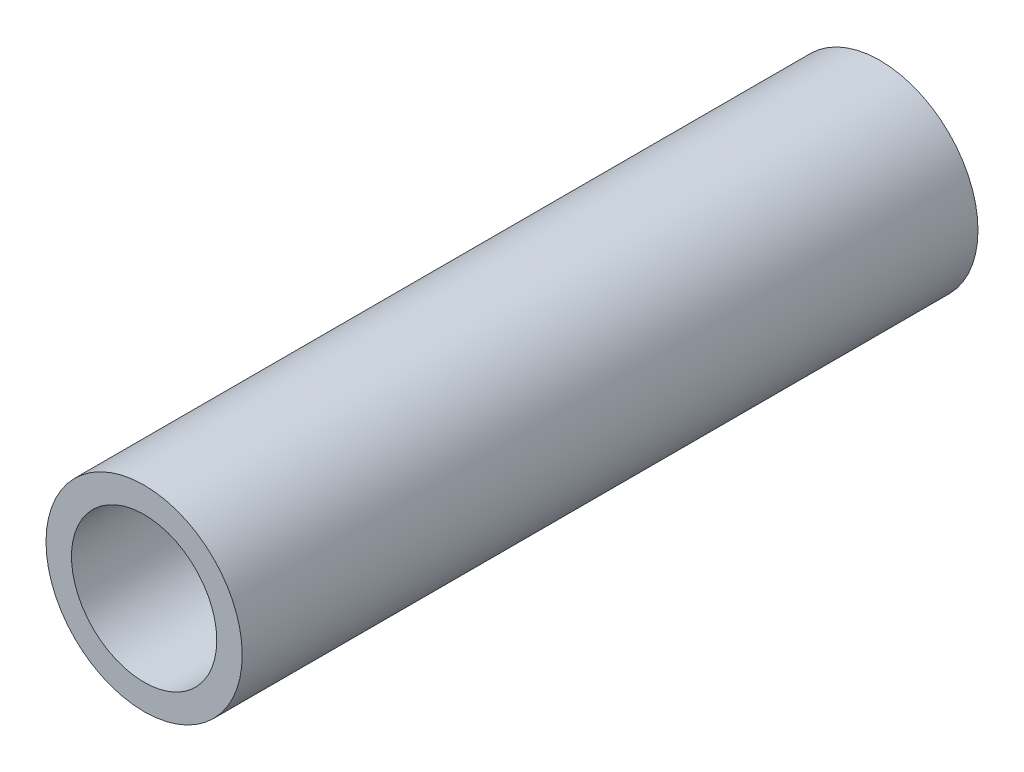
ISO-10303-21;
HEADER;
FILE_DESCRIPTION(('STEP AP214'),'2;1');
FILE_NAME('part.step','',(''),(''),'','','');
FILE_SCHEMA(('AUTOMOTIVE_DESIGN { 1 0 10303 214 1 1 1 1 }'));
ENDSEC;
DATA;
#1=APPLICATION_CONTEXT('core data for automotive mechanical design processes');
#2=APPLICATION_PROTOCOL_DEFINITION('international standard','automotive_design',2000,#1);
#3=PRODUCT_CONTEXT('',#1,'mechanical');
#4=PRODUCT('Part','Part','',(#3));
#5=PRODUCT_RELATED_PRODUCT_CATEGORY('part','',(#4));
#6=PRODUCT_DEFINITION_FORMATION('','',#4);
#7=PRODUCT_DEFINITION_CONTEXT('part definition',#1,'design');
#8=PRODUCT_DEFINITION('design','',#6,#7);
#9=PRODUCT_DEFINITION_SHAPE('','',#8);
#10=(LENGTH_UNIT() NAMED_UNIT(*) SI_UNIT(.MILLI.,.METRE.));
#11=(NAMED_UNIT(*) PLANE_ANGLE_UNIT() SI_UNIT($,.RADIAN.));
#12=(NAMED_UNIT(*) SI_UNIT($,.STERADIAN.) SOLID_ANGLE_UNIT());
#13=UNCERTAINTY_MEASURE_WITH_UNIT(LENGTH_MEASURE(1.E-05),#10,'distance_accuracy_value','');
#14=(GEOMETRIC_REPRESENTATION_CONTEXT(3) GLOBAL_UNCERTAINTY_ASSIGNED_CONTEXT((#13)) GLOBAL_UNIT_ASSIGNED_CONTEXT((#10,
#11,#12)) REPRESENTATION_CONTEXT('',''));
#15=CARTESIAN_POINT('',(0.,0.,0.));
#16=DIRECTION('',(0.,0.,1.));
#17=DIRECTION('',(1.,0.,0.));
#18=AXIS2_PLACEMENT_3D('',#15,#16,#17);
#19=CARTESIAN_POINT('',(0.,0.,40.));
#20=DIRECTION('',(0.,0.,1.));
#21=DIRECTION('',(1.,0.,0.));
#22=AXIS2_PLACEMENT_3D('',#19,#20,#21);
#23=PLANE('',#22);
#24=CARTESIAN_POINT('',(0.,0.,40.));
#25=DIRECTION('',(0.,0.,1.));
#26=DIRECTION('',(1.,0.,0.));
#27=AXIS2_PLACEMENT_3D('',#24,#25,#26);
#28=CIRCLE('',#27,10.668);
#29=CARTESIAN_POINT('',(10.668,0.,40.));
#30=VERTEX_POINT('',#29);
#31=EDGE_CURVE('E11',#30,#30,#28,.T.);
#32=ORIENTED_EDGE('',*,*,#31,.T.);
#33=EDGE_LOOP('',(#32));
#34=FACE_BOUND('',#33,.T.);
#35=CARTESIAN_POINT('',(0.,0.,40.));
#36=DIRECTION('',(0.,0.,1.));
#37=DIRECTION('',(1.,0.,0.));
#38=AXIS2_PLACEMENT_3D('',#35,#36,#37);
#39=CIRCLE('',#38,7.8994);
#40=CARTESIAN_POINT('',(7.8994,0.,40.));
#41=VERTEX_POINT('',#40);
#42=EDGE_CURVE('E56',#41,#41,#39,.T.);
#43=ORIENTED_EDGE('',*,*,#42,.F.);
#44=EDGE_LOOP('',(#43));
#45=FACE_BOUND('',#44,.T.);
#46=ADVANCED_FACE('F43',(#34,#45),#23,.T.);
#47=CARTESIAN_POINT('',(0.,0.,-40.));
#48=DIRECTION('',(0.,0.,1.));
#49=DIRECTION('',(1.,0.,0.));
#50=AXIS2_PLACEMENT_3D('',#47,#48,#49);
#51=PLANE('',#50);
#52=CARTESIAN_POINT('',(0.,0.,-40.));
#53=DIRECTION('',(0.,0.,1.));
#54=DIRECTION('',(1.,0.,0.));
#55=AXIS2_PLACEMENT_3D('',#52,#53,#54);
#56=CIRCLE('',#55,10.668);
#57=CARTESIAN_POINT('',(10.668,0.,-40.));
#58=VERTEX_POINT('',#57);
#59=EDGE_CURVE('E47',#58,#58,#56,.T.);
#60=ORIENTED_EDGE('',*,*,#59,.F.);
#61=EDGE_LOOP('',(#60));
#62=FACE_BOUND('',#61,.T.);
#63=CARTESIAN_POINT('',(0.,0.,-40.));
#64=DIRECTION('',(0.,0.,1.));
#65=DIRECTION('',(1.,0.,0.));
#66=AXIS2_PLACEMENT_3D('',#63,#64,#65);
#67=CIRCLE('',#66,7.8994);
#68=CARTESIAN_POINT('',(7.8994,0.,-40.));
#69=VERTEX_POINT('',#68);
#70=EDGE_CURVE('E58',#69,#69,#67,.T.);
#71=ORIENTED_EDGE('',*,*,#70,.T.);
#72=EDGE_LOOP('',(#71));
#73=FACE_BOUND('',#72,.T.);
#74=ADVANCED_FACE('F70',(#62,#73),#51,.F.);
#75=CARTESIAN_POINT('',(0.,0.,40.));
#76=DIRECTION('',(0.,0.,-1.));
#77=DIRECTION('',(-1.,0.,0.));
#78=AXIS2_PLACEMENT_3D('',#75,#76,#77);
#79=CYLINDRICAL_SURFACE('',#78,10.668);
#80=ORIENTED_EDGE('',*,*,#31,.F.);
#81=EDGE_LOOP('',(#80));
#82=FACE_BOUND('',#81,.T.);
#83=ORIENTED_EDGE('',*,*,#59,.T.);
#84=EDGE_LOOP('',(#83));
#85=FACE_BOUND('',#84,.T.);
#86=ADVANCED_FACE('F45',(#82,#85),#79,.T.);
#87=CARTESIAN_POINT('',(0.,0.,40.));
#88=DIRECTION('',(0.,0.,-1.));
#89=DIRECTION('',(-1.,0.,0.));
#90=AXIS2_PLACEMENT_3D('',#87,#88,#89);
#91=CYLINDRICAL_SURFACE('',#90,7.8994);
#92=ORIENTED_EDGE('',*,*,#42,.T.);
#93=EDGE_LOOP('',(#92));
#94=FACE_BOUND('',#93,.T.);
#95=ORIENTED_EDGE('',*,*,#70,.F.);
#96=EDGE_LOOP('',(#95));
#97=FACE_BOUND('',#96,.T.);
#98=ADVANCED_FACE('F66',(#94,#97),#91,.F.);
#99=CLOSED_SHELL('',(#46,#74,#86,#98));
#100=MANIFOLD_SOLID_BREP('B2',#99);
#101=ADVANCED_BREP_SHAPE_REPRESENTATION('',(#18,#100),#14);
#102=SHAPE_DEFINITION_REPRESENTATION(#9,#101);
ENDSEC;
END-ISO-10303-21;
